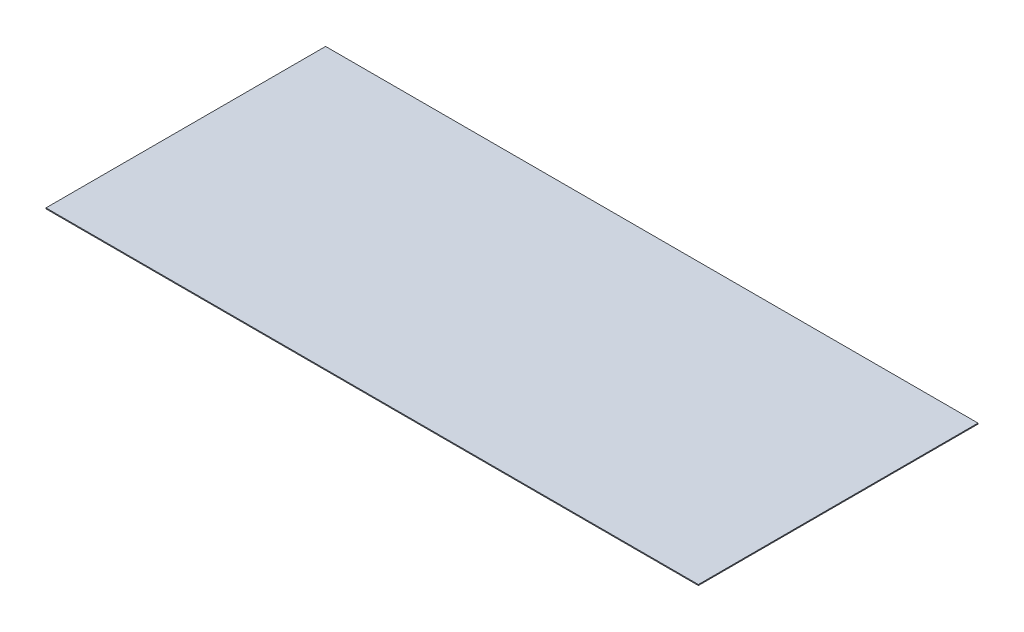
ISO-10303-21;
HEADER;
FILE_DESCRIPTION(('STEP AP214'),'2;1');
FILE_NAME('part.step','',(''),(''),'','','');
FILE_SCHEMA(('AUTOMOTIVE_DESIGN { 1 0 10303 214 1 1 1 1 }'));
ENDSEC;
DATA;
#1=APPLICATION_CONTEXT('core data for automotive mechanical design processes');
#2=APPLICATION_PROTOCOL_DEFINITION('international standard','automotive_design',2000,#1);
#3=PRODUCT_CONTEXT('',#1,'mechanical');
#4=PRODUCT('Part','Part','',(#3));
#5=PRODUCT_RELATED_PRODUCT_CATEGORY('part','',(#4));
#6=PRODUCT_DEFINITION_FORMATION('','',#4);
#7=PRODUCT_DEFINITION_CONTEXT('part definition',#1,'design');
#8=PRODUCT_DEFINITION('design','',#6,#7);
#9=PRODUCT_DEFINITION_SHAPE('','',#8);
#10=(LENGTH_UNIT() NAMED_UNIT(*) SI_UNIT(.MILLI.,.METRE.));
#11=(NAMED_UNIT(*) PLANE_ANGLE_UNIT() SI_UNIT($,.RADIAN.));
#12=(NAMED_UNIT(*) SI_UNIT($,.STERADIAN.) SOLID_ANGLE_UNIT());
#13=UNCERTAINTY_MEASURE_WITH_UNIT(LENGTH_MEASURE(1.E-05),#10,'distance_accuracy_value','');
#14=(GEOMETRIC_REPRESENTATION_CONTEXT(3) GLOBAL_UNCERTAINTY_ASSIGNED_CONTEXT((#13)) GLOBAL_UNIT_ASSIGNED_CONTEXT((#10,
#11,#12)) REPRESENTATION_CONTEXT('',''));
#15=CARTESIAN_POINT('',(0.,0.,0.));
#16=DIRECTION('',(0.,0.,1.));
#17=DIRECTION('',(1.,0.,0.));
#18=AXIS2_PLACEMENT_3D('',#15,#16,#17);
#19=CARTESIAN_POINT('',(7000.,-20.,-3000.));
#20=DIRECTION('',(1.,0.,0.));
#21=DIRECTION('',(0.,0.,-1.));
#22=AXIS2_PLACEMENT_3D('',#19,#20,#21);
#23=PLANE('',#22);
#24=DIRECTION('',(0.,0.,-1.));
#25=VECTOR('',#24,1.);
#26=CARTESIAN_POINT('',(7000.,0.,-3000.));
#27=LINE('',#26,#25);
#28=CARTESIAN_POINT('',(7000.00000000001,0.,3000.));
#29=VERTEX_POINT('',#28);
#30=CARTESIAN_POINT('',(7000.,0.,-3000.));
#31=VERTEX_POINT('',#30);
#32=EDGE_CURVE('E115',#29,#31,#27,.T.);
#33=ORIENTED_EDGE('',*,*,#32,.F.);
#34=DIRECTION('',(0.,1.,0.));
#35=VECTOR('',#34,1.);
#36=CARTESIAN_POINT('',(7000.00000000001,-20.,3000.));
#37=LINE('',#36,#35);
#38=CARTESIAN_POINT('',(7000.00000000001,-20.,3000.));
#39=VERTEX_POINT('',#38);
#40=EDGE_CURVE('E11',#39,#29,#37,.T.);
#41=ORIENTED_EDGE('',*,*,#40,.F.);
#42=DIRECTION('',(0.,0.,-1.));
#43=VECTOR('',#42,1.);
#44=CARTESIAN_POINT('',(7000.,-20.,-3000.));
#45=LINE('',#44,#43);
#46=CARTESIAN_POINT('',(7000.,-20.,-3000.));
#47=VERTEX_POINT('',#46);
#48=EDGE_CURVE('E107',#39,#47,#45,.T.);
#49=ORIENTED_EDGE('',*,*,#48,.T.);
#50=DIRECTION('',(0.,1.,0.));
#51=VECTOR('',#50,1.);
#52=CARTESIAN_POINT('',(7000.,-20.,-3000.));
#53=LINE('',#52,#51);
#54=EDGE_CURVE('E48',#47,#31,#53,.T.);
#55=ORIENTED_EDGE('',*,*,#54,.T.);
#56=EDGE_LOOP('',(#33,#41,#49,#55));
#57=FACE_BOUND('',#56,.T.);
#58=ADVANCED_FACE('F45',(#57),#23,.T.);
#59=CARTESIAN_POINT('',(-7000.,-20.,3000.));
#60=DIRECTION('',(0.,0.,1.));
#61=DIRECTION('',(1.,0.,0.));
#62=AXIS2_PLACEMENT_3D('',#59,#60,#61);
#63=PLANE('',#62);
#64=DIRECTION('',(1.,0.,0.));
#65=VECTOR('',#64,1.);
#66=CARTESIAN_POINT('',(-7000.,0.,3000.));
#67=LINE('',#66,#65);
#68=CARTESIAN_POINT('',(-7000.,0.,3000.));
#69=VERTEX_POINT('',#68);
#70=EDGE_CURVE('E110',#69,#29,#67,.T.);
#71=ORIENTED_EDGE('',*,*,#70,.F.);
#72=DIRECTION('',(0.,1.,0.));
#73=VECTOR('',#72,1.);
#74=CARTESIAN_POINT('',(-7000.,-20.,3000.));
#75=LINE('',#74,#73);
#76=CARTESIAN_POINT('',(-7000.,-20.,3000.));
#77=VERTEX_POINT('',#76);
#78=EDGE_CURVE('E55',#77,#69,#75,.T.);
#79=ORIENTED_EDGE('',*,*,#78,.F.);
#80=DIRECTION('',(1.,0.,0.));
#81=VECTOR('',#80,1.);
#82=CARTESIAN_POINT('',(-7000.,-20.,3000.));
#83=LINE('',#82,#81);
#84=EDGE_CURVE('E102',#77,#39,#83,.T.);
#85=ORIENTED_EDGE('',*,*,#84,.T.);
#86=ORIENTED_EDGE('',*,*,#40,.T.);
#87=EDGE_LOOP('',(#71,#79,#85,#86));
#88=FACE_BOUND('',#87,.T.);
#89=ADVANCED_FACE('F131',(#88),#63,.T.);
#90=CARTESIAN_POINT('',(-7000.,-20.,-3000.));
#91=DIRECTION('',(-1.,0.,0.));
#92=DIRECTION('',(0.,0.,1.));
#93=AXIS2_PLACEMENT_3D('',#90,#91,#92);
#94=PLANE('',#93);
#95=DIRECTION('',(0.,0.,1.));
#96=VECTOR('',#95,1.);
#97=CARTESIAN_POINT('',(-7000.,0.,-3000.));
#98=LINE('',#97,#96);
#99=CARTESIAN_POINT('',(-7000.,0.,-3000.));
#100=VERTEX_POINT('',#99);
#101=EDGE_CURVE('E96',#100,#69,#98,.T.);
#102=ORIENTED_EDGE('',*,*,#101,.F.);
#103=DIRECTION('',(0.,1.,0.));
#104=VECTOR('',#103,1.);
#105=CARTESIAN_POINT('',(-7000.,-20.,-3000.));
#106=LINE('',#105,#104);
#107=CARTESIAN_POINT('',(-7000.,-20.,-3000.));
#108=VERTEX_POINT('',#107);
#109=EDGE_CURVE('E91',#108,#100,#106,.T.);
#110=ORIENTED_EDGE('',*,*,#109,.F.);
#111=DIRECTION('',(0.,0.,1.));
#112=VECTOR('',#111,1.);
#113=CARTESIAN_POINT('',(-7000.,-20.,-3000.));
#114=LINE('',#113,#112);
#115=EDGE_CURVE('E94',#108,#77,#114,.T.);
#116=ORIENTED_EDGE('',*,*,#115,.T.);
#117=ORIENTED_EDGE('',*,*,#78,.T.);
#118=EDGE_LOOP('',(#102,#110,#116,#117));
#119=FACE_BOUND('',#118,.T.);
#120=ADVANCED_FACE('F93',(#119),#94,.T.);
#121=CARTESIAN_POINT('',(-7000.,-20.,-3000.));
#122=DIRECTION('',(0.,0.,-1.));
#123=DIRECTION('',(-1.,0.,0.));
#124=AXIS2_PLACEMENT_3D('',#121,#122,#123);
#125=PLANE('',#124);
#126=DIRECTION('',(-1.,0.,0.));
#127=VECTOR('',#126,1.);
#128=CARTESIAN_POINT('',(-7000.,0.,-3000.));
#129=LINE('',#128,#127);
#130=EDGE_CURVE('E119',#31,#100,#129,.T.);
#131=ORIENTED_EDGE('',*,*,#130,.F.);
#132=ORIENTED_EDGE('',*,*,#54,.F.);
#133=DIRECTION('',(-1.,0.,0.));
#134=VECTOR('',#133,1.);
#135=CARTESIAN_POINT('',(-7000.,-20.,-3000.));
#136=LINE('',#135,#134);
#137=EDGE_CURVE('E101',#47,#108,#136,.T.);
#138=ORIENTED_EDGE('',*,*,#137,.T.);
#139=ORIENTED_EDGE('',*,*,#109,.T.);
#140=EDGE_LOOP('',(#131,#132,#138,#139));
#141=FACE_BOUND('',#140,.T.);
#142=ADVANCED_FACE('F105',(#141),#125,.T.);
#143=CARTESIAN_POINT('',(0.,-20.,0.));
#144=DIRECTION('',(0.,1.,0.));
#145=DIRECTION('',(0.,0.,1.));
#146=AXIS2_PLACEMENT_3D('',#143,#144,#145);
#147=PLANE('',#146);
#148=ORIENTED_EDGE('',*,*,#48,.F.);
#149=ORIENTED_EDGE('',*,*,#84,.F.);
#150=ORIENTED_EDGE('',*,*,#115,.F.);
#151=ORIENTED_EDGE('',*,*,#137,.F.);
#152=EDGE_LOOP('',(#148,#149,#150,#151));
#153=FACE_BOUND('',#152,.T.);
#154=ADVANCED_FACE('F100',(#153),#147,.F.);
#155=CARTESIAN_POINT('',(0.,0.,0.));
#156=DIRECTION('',(0.,1.,0.));
#157=DIRECTION('',(0.,0.,1.));
#158=AXIS2_PLACEMENT_3D('',#155,#156,#157);
#159=PLANE('',#158);
#160=ORIENTED_EDGE('',*,*,#32,.T.);
#161=ORIENTED_EDGE('',*,*,#130,.T.);
#162=ORIENTED_EDGE('',*,*,#101,.T.);
#163=ORIENTED_EDGE('',*,*,#70,.T.);
#164=EDGE_LOOP('',(#160,#161,#162,#163));
#165=FACE_BOUND('',#164,.T.);
#166=ADVANCED_FACE('F130',(#165),#159,.T.);
#167=CLOSED_SHELL('',(#58,#89,#120,#142,#154,#166));
#168=MANIFOLD_SOLID_BREP('B2',#167);
#169=ADVANCED_BREP_SHAPE_REPRESENTATION('',(#18,#168),#14);
#170=SHAPE_DEFINITION_REPRESENTATION(#9,#169);
ENDSEC;
END-ISO-10303-21;
